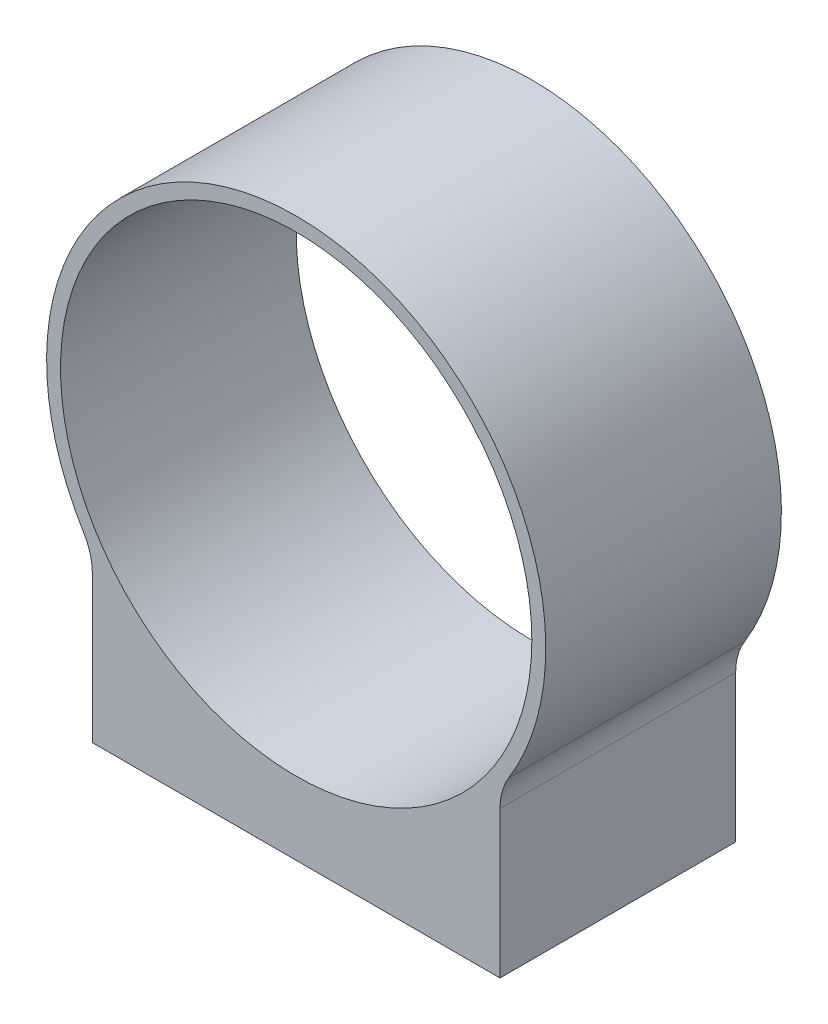
ISO-10303-21;
HEADER;
FILE_DESCRIPTION(('STEP AP214'),'2;1');
FILE_NAME('part.step','',(''),(''),'','','');
FILE_SCHEMA(('AUTOMOTIVE_DESIGN { 1 0 10303 214 1 1 1 1 }'));
ENDSEC;
DATA;
#1=APPLICATION_CONTEXT('core data for automotive mechanical design processes');
#2=APPLICATION_PROTOCOL_DEFINITION('international standard','automotive_design',2000,#1);
#3=PRODUCT_CONTEXT('',#1,'mechanical');
#4=PRODUCT('Part','Part','',(#3));
#5=PRODUCT_RELATED_PRODUCT_CATEGORY('part','',(#4));
#6=PRODUCT_DEFINITION_FORMATION('','',#4);
#7=PRODUCT_DEFINITION_CONTEXT('part definition',#1,'design');
#8=PRODUCT_DEFINITION('design','',#6,#7);
#9=PRODUCT_DEFINITION_SHAPE('','',#8);
#10=(LENGTH_UNIT() NAMED_UNIT(*) SI_UNIT(.MILLI.,.METRE.));
#11=(NAMED_UNIT(*) PLANE_ANGLE_UNIT() SI_UNIT($,.RADIAN.));
#12=(NAMED_UNIT(*) SI_UNIT($,.STERADIAN.) SOLID_ANGLE_UNIT());
#13=UNCERTAINTY_MEASURE_WITH_UNIT(LENGTH_MEASURE(1.E-05),#10,'distance_accuracy_value','');
#14=(GEOMETRIC_REPRESENTATION_CONTEXT(3) GLOBAL_UNCERTAINTY_ASSIGNED_CONTEXT((#13)) GLOBAL_UNIT_ASSIGNED_CONTEXT((#10,
#11,#12)) REPRESENTATION_CONTEXT('',''));
#15=CARTESIAN_POINT('',(0.,0.,0.));
#16=DIRECTION('',(0.,0.,1.));
#17=DIRECTION('',(1.,0.,0.));
#18=AXIS2_PLACEMENT_3D('',#15,#16,#17);
#19=CARTESIAN_POINT('',(0.,-52.3654098116473,40.));
#20=DIRECTION('',(0.,1.,0.));
#21=DIRECTION('',(-1.,0.,0.));
#22=AXIS2_PLACEMENT_3D('',#19,#20,#21);
#23=PLANE('',#22);
#24=CARTESIAN_POINT('',(-17.2996481832968,-52.3654098116473,20.));
#25=DIRECTION('',(0.,-1.,0.));
#26=DIRECTION('',(0.,0.,-1.));
#27=AXIS2_PLACEMENT_3D('',#24,#25,#26);
#28=CIRCLE('',#27,8.64394443249568);
#29=CARTESIAN_POINT('',(-17.2996481832968,-52.3654098116473,11.3560555675043));
#30=VERTEX_POINT('',#29);
#31=EDGE_CURVE('E302',#30,#30,#28,.T.);
#32=ORIENTED_EDGE('',*,*,#31,.F.);
#33=EDGE_LOOP('',(#32));
#34=FACE_BOUND('',#33,.T.);
#35=CARTESIAN_POINT('',(17.2996481832968,-52.3654098116473,20.));
#36=DIRECTION('',(0.,-1.,0.));
#37=DIRECTION('',(0.,0.,-1.));
#38=AXIS2_PLACEMENT_3D('',#35,#36,#37);
#39=CIRCLE('',#38,8.64394443249568);
#40=CARTESIAN_POINT('',(17.2996481832968,-52.3654098116473,11.3560555675043));
#41=VERTEX_POINT('',#40);
#42=EDGE_CURVE('E300',#41,#41,#39,.T.);
#43=ORIENTED_EDGE('',*,*,#42,.F.);
#44=EDGE_LOOP('',(#43));
#45=FACE_BOUND('',#44,.T.);
#46=DIRECTION('',(1.,0.,0.));
#47=VECTOR('',#46,1.);
#48=CARTESIAN_POINT('',(0.,-52.3654098116473,0.));
#49=LINE('',#48,#47);
#50=CARTESIAN_POINT('',(-34.5992963665935,-52.3654098116473,0.));
#51=VERTEX_POINT('',#50);
#52=CARTESIAN_POINT('',(34.5992963665935,-52.3654098116473,0.));
#53=VERTEX_POINT('',#52);
#54=EDGE_CURVE('E106',#51,#53,#49,.T.);
#55=ORIENTED_EDGE('',*,*,#54,.T.);
#56=DIRECTION('',(0.,0.,-1.));
#57=VECTOR('',#56,1.);
#58=CARTESIAN_POINT('',(34.5992963665935,-52.3654098116473,40.));
#59=LINE('',#58,#57);
#60=CARTESIAN_POINT('',(34.5992963665935,-52.3654098116473,40.));
#61=VERTEX_POINT('',#60);
#62=EDGE_CURVE('E88',#61,#53,#59,.T.);
#63=ORIENTED_EDGE('',*,*,#62,.F.);
#64=DIRECTION('',(1.,0.,0.));
#65=VECTOR('',#64,1.);
#66=CARTESIAN_POINT('',(0.,-52.3654098116473,40.));
#67=LINE('',#66,#65);
#68=CARTESIAN_POINT('',(-34.5992963665935,-52.3654098116473,40.));
#69=VERTEX_POINT('',#68);
#70=EDGE_CURVE('E93',#69,#61,#67,.T.);
#71=ORIENTED_EDGE('',*,*,#70,.F.);
#72=DIRECTION('',(0.,0.,-1.));
#73=VECTOR('',#72,1.);
#74=CARTESIAN_POINT('',(-34.5992963665935,-52.3654098116473,40.));
#75=LINE('',#74,#73);
#76=EDGE_CURVE('E108',#69,#51,#75,.T.);
#77=ORIENTED_EDGE('',*,*,#76,.T.);
#78=EDGE_LOOP('',(#55,#63,#71,#77));
#79=FACE_BOUND('',#78,.T.);
#80=ADVANCED_FACE('F35',(#34,#45,#79),#23,.F.);
#81=CARTESIAN_POINT('',(34.5992963665935,0.,40.));
#82=DIRECTION('',(1.,0.,0.));
#83=DIRECTION('',(0.,0.,-1.));
#84=AXIS2_PLACEMENT_3D('',#81,#82,#83);
#85=PLANE('',#84);
#86=DIRECTION('',(0.,-1.,0.));
#87=VECTOR('',#86,1.);
#88=CARTESIAN_POINT('',(34.5992963665935,0.,0.));
#89=LINE('',#88,#87);
#90=CARTESIAN_POINT('',(34.5992963665935,-27.4415943192775,0.));
#91=VERTEX_POINT('',#90);
#92=EDGE_CURVE('E144',#91,#53,#89,.T.);
#93=ORIENTED_EDGE('',*,*,#92,.F.);
#94=DIRECTION('',(0.,0.,-1.));
#95=VECTOR('',#94,1.);
#96=CARTESIAN_POINT('',(34.5992963665935,-27.4415943192775,40.));
#97=LINE('',#96,#95);
#98=CARTESIAN_POINT('',(34.5992963665935,-27.4415943192775,40.));
#99=VERTEX_POINT('',#98);
#100=EDGE_CURVE('E50',#91,#99,#97,.F.);
#101=ORIENTED_EDGE('',*,*,#100,.T.);
#102=DIRECTION('',(0.,-1.,0.));
#103=VECTOR('',#102,1.);
#104=CARTESIAN_POINT('',(34.5992963665935,0.,40.));
#105=LINE('',#104,#103);
#106=EDGE_CURVE('E84',#99,#61,#105,.T.);
#107=ORIENTED_EDGE('',*,*,#106,.T.);
#108=ORIENTED_EDGE('',*,*,#62,.T.);
#109=EDGE_LOOP('',(#93,#101,#107,#108));
#110=FACE_BOUND('',#109,.T.);
#111=ADVANCED_FACE('F86',(#110),#85,.T.);
#112=CARTESIAN_POINT('',(0.,0.,40.));
#113=DIRECTION('',(0.,0.,-1.));
#114=DIRECTION('',(-1.,0.,0.));
#115=AXIS2_PLACEMENT_3D('',#112,#113,#114);
#116=CYLINDRICAL_SURFACE('',#115,42.3654307265685);
#117=CARTESIAN_POINT('',(0.,0.,0.));
#118=DIRECTION('',(0.,0.,1.));
#119=DIRECTION('',(1.,0.,0.));
#120=AXIS2_PLACEMENT_3D('',#117,#118,#119);
#121=CIRCLE('',#120,42.3654307265685);
#122=CARTESIAN_POINT('',(36.0823614826864,-22.2011916455047,0.));
#123=VERTEX_POINT('',#122);
#124=CARTESIAN_POINT('',(-36.0823614826864,-22.2011916455047,0.));
#125=VERTEX_POINT('',#124);
#126=EDGE_CURVE('E139',#123,#125,#121,.T.);
#127=ORIENTED_EDGE('',*,*,#126,.T.);
#128=DIRECTION('',(0.,0.,-1.));
#129=VECTOR('',#128,1.);
#130=CARTESIAN_POINT('',(-36.0823614826864,-22.2011916455047,40.));
#131=LINE('',#130,#129);
#132=CARTESIAN_POINT('',(-36.0823614826864,-22.2011916455047,40.));
#133=VERTEX_POINT('',#132);
#134=EDGE_CURVE('E119',#125,#133,#131,.F.);
#135=ORIENTED_EDGE('',*,*,#134,.T.);
#136=CARTESIAN_POINT('',(0.,0.,40.));
#137=DIRECTION('',(0.,0.,1.));
#138=DIRECTION('',(1.,0.,0.));
#139=AXIS2_PLACEMENT_3D('',#136,#137,#138);
#140=CIRCLE('',#139,42.3654307265685);
#141=CARTESIAN_POINT('',(36.0823614826864,-22.2011916455047,40.));
#142=VERTEX_POINT('',#141);
#143=EDGE_CURVE('E92',#142,#133,#140,.T.);
#144=ORIENTED_EDGE('',*,*,#143,.F.);
#145=DIRECTION('',(0.,0.,-1.));
#146=VECTOR('',#145,1.);
#147=CARTESIAN_POINT('',(36.0823614826864,-22.2011916455047,40.));
#148=LINE('',#147,#146);
#149=EDGE_CURVE('E111',#142,#123,#148,.T.);
#150=ORIENTED_EDGE('',*,*,#149,.T.);
#151=EDGE_LOOP('',(#127,#135,#144,#150));
#152=FACE_BOUND('',#151,.T.);
#153=ADVANCED_FACE('F142',(#152),#116,.T.);
#154=CARTESIAN_POINT('',(-34.5992963665935,0.,40.));
#155=DIRECTION('',(1.,0.,0.));
#156=DIRECTION('',(0.,0.,-1.));
#157=AXIS2_PLACEMENT_3D('',#154,#155,#156);
#158=PLANE('',#157);
#159=DIRECTION('',(0.,-1.,0.));
#160=VECTOR('',#159,1.);
#161=CARTESIAN_POINT('',(-34.5992963665935,0.,40.));
#162=LINE('',#161,#160);
#163=CARTESIAN_POINT('',(-34.5992963665935,-27.4415943192775,40.));
#164=VERTEX_POINT('',#163);
#165=EDGE_CURVE('E99',#164,#69,#162,.T.);
#166=ORIENTED_EDGE('',*,*,#165,.F.);
#167=DIRECTION('',(0.,0.,1.));
#168=VECTOR('',#167,1.);
#169=CARTESIAN_POINT('',(-34.5992963665935,-27.4415943192775,0.));
#170=LINE('',#169,#168);
#171=CARTESIAN_POINT('',(-34.5992963665935,-27.4415943192775,0.));
#172=VERTEX_POINT('',#171);
#173=EDGE_CURVE('E107',#164,#172,#170,.F.);
#174=ORIENTED_EDGE('',*,*,#173,.T.);
#175=DIRECTION('',(0.,-1.,0.));
#176=VECTOR('',#175,1.);
#177=CARTESIAN_POINT('',(-34.5992963665935,0.,0.));
#178=LINE('',#177,#176);
#179=EDGE_CURVE('E140',#172,#51,#178,.T.);
#180=ORIENTED_EDGE('',*,*,#179,.T.);
#181=ORIENTED_EDGE('',*,*,#76,.F.);
#182=EDGE_LOOP('',(#166,#174,#180,#181));
#183=FACE_BOUND('',#182,.T.);
#184=ADVANCED_FACE('F132',(#183),#158,.F.);
#185=CARTESIAN_POINT('',(0.,0.,40.));
#186=DIRECTION('',(0.,0.,-1.));
#187=DIRECTION('',(-1.,0.,0.));
#188=AXIS2_PLACEMENT_3D('',#185,#186,#187);
#189=CYLINDRICAL_SURFACE('',#188,40.);
#190=CARTESIAN_POINT('',(0.,0.,40.));
#191=DIRECTION('',(0.,0.,1.));
#192=DIRECTION('',(1.,0.,0.));
#193=AXIS2_PLACEMENT_3D('',#190,#191,#192);
#194=CIRCLE('',#193,40.);
#195=CARTESIAN_POINT('',(40.,0.,40.));
#196=VERTEX_POINT('',#195);
#197=EDGE_CURVE('E113',#196,#196,#194,.T.);
#198=ORIENTED_EDGE('',*,*,#197,.T.);
#199=EDGE_LOOP('',(#198));
#200=FACE_BOUND('',#199,.T.);
#201=CARTESIAN_POINT('',(0.,0.,0.));
#202=DIRECTION('',(0.,0.,1.));
#203=DIRECTION('',(1.,0.,0.));
#204=AXIS2_PLACEMENT_3D('',#201,#202,#203);
#205=CIRCLE('',#204,40.);
#206=CARTESIAN_POINT('',(40.,0.,0.));
#207=VERTEX_POINT('',#206);
#208=EDGE_CURVE('E103',#207,#207,#205,.T.);
#209=ORIENTED_EDGE('',*,*,#208,.F.);
#210=EDGE_LOOP('',(#209));
#211=FACE_BOUND('',#210,.T.);
#212=ADVANCED_FACE('F152',(#200,#211),#189,.F.);
#213=CARTESIAN_POINT('',(0.,0.,40.));
#214=DIRECTION('',(0.,0.,1.));
#215=DIRECTION('',(1.,0.,0.));
#216=AXIS2_PLACEMENT_3D('',#213,#214,#215);
#217=PLANE('',#216);
#218=ORIENTED_EDGE('',*,*,#70,.T.);
#219=ORIENTED_EDGE('',*,*,#106,.F.);
#220=CARTESIAN_POINT('',(44.5992963665935,-27.4415943192775,40.));
#221=DIRECTION('',(0.,0.,1.));
#222=DIRECTION('',(1.,0.,0.));
#223=AXIS2_PLACEMENT_3D('',#220,#221,#222);
#224=CIRCLE('',#223,10.);
#225=EDGE_CURVE('E11',#99,#142,#224,.F.);
#226=ORIENTED_EDGE('',*,*,#225,.T.);
#227=ORIENTED_EDGE('',*,*,#143,.T.);
#228=CARTESIAN_POINT('',(-44.5992963665935,-27.4415943192775,40.));
#229=DIRECTION('',(0.,0.,1.));
#230=DIRECTION('',(1.,0.,0.));
#231=AXIS2_PLACEMENT_3D('',#228,#229,#230);
#232=CIRCLE('',#231,10.);
#233=EDGE_CURVE('E124',#133,#164,#232,.F.);
#234=ORIENTED_EDGE('',*,*,#233,.T.);
#235=ORIENTED_EDGE('',*,*,#165,.T.);
#236=EDGE_LOOP('',(#218,#219,#226,#227,#234,#235));
#237=FACE_BOUND('',#236,.T.);
#238=ORIENTED_EDGE('',*,*,#197,.F.);
#239=EDGE_LOOP('',(#238));
#240=FACE_BOUND('',#239,.T.);
#241=ADVANCED_FACE('F96',(#237,#240),#217,.T.);
#242=CARTESIAN_POINT('',(0.,0.,0.));
#243=DIRECTION('',(0.,0.,1.));
#244=DIRECTION('',(1.,0.,0.));
#245=AXIS2_PLACEMENT_3D('',#242,#243,#244);
#246=PLANE('',#245);
#247=ORIENTED_EDGE('',*,*,#54,.F.);
#248=ORIENTED_EDGE('',*,*,#179,.F.);
#249=CARTESIAN_POINT('',(-44.5992963665935,-27.4415943192775,0.));
#250=DIRECTION('',(0.,0.,1.));
#251=DIRECTION('',(1.,0.,0.));
#252=AXIS2_PLACEMENT_3D('',#249,#250,#251);
#253=CIRCLE('',#252,10.);
#254=EDGE_CURVE('E122',#172,#125,#253,.T.);
#255=ORIENTED_EDGE('',*,*,#254,.T.);
#256=ORIENTED_EDGE('',*,*,#126,.F.);
#257=CARTESIAN_POINT('',(44.5992963665935,-27.4415943192775,0.));
#258=DIRECTION('',(0.,0.,1.));
#259=DIRECTION('',(1.,0.,0.));
#260=AXIS2_PLACEMENT_3D('',#257,#258,#259);
#261=CIRCLE('',#260,10.);
#262=EDGE_CURVE('E43',#123,#91,#261,.T.);
#263=ORIENTED_EDGE('',*,*,#262,.T.);
#264=ORIENTED_EDGE('',*,*,#92,.T.);
#265=EDGE_LOOP('',(#247,#248,#255,#256,#263,#264));
#266=FACE_BOUND('',#265,.T.);
#267=ORIENTED_EDGE('',*,*,#208,.T.);
#268=EDGE_LOOP('',(#267));
#269=FACE_BOUND('',#268,.T.);
#270=ADVANCED_FACE('F137',(#266,#269),#246,.F.);
#271=CARTESIAN_POINT('',(17.2996481832968,-42.3654098116473,20.));
#272=DIRECTION('',(0.,-1.,0.));
#273=DIRECTION('',(0.,0.,-1.));
#274=AXIS2_PLACEMENT_3D('',#271,#272,#273);
#275=CYLINDRICAL_SURFACE('',#274,8.64394443249568);
#276=CARTESIAN_POINT('',(17.2996481832968,-42.3654098116473,20.));
#277=DIRECTION('',(0.,-1.,0.));
#278=DIRECTION('',(0.,0.,-1.));
#279=AXIS2_PLACEMENT_3D('',#276,#277,#278);
#280=CIRCLE('',#279,8.64394443249568);
#281=CARTESIAN_POINT('',(17.2996481832968,-42.3654098116473,11.3560555675043));
#282=VERTEX_POINT('',#281);
#283=EDGE_CURVE('E297',#282,#282,#280,.T.);
#284=ORIENTED_EDGE('',*,*,#283,.F.);
#285=EDGE_LOOP('',(#284));
#286=FACE_BOUND('',#285,.T.);
#287=ORIENTED_EDGE('',*,*,#42,.T.);
#288=EDGE_LOOP('',(#287));
#289=FACE_BOUND('',#288,.T.);
#290=ADVANCED_FACE('F194',(#286,#289),#275,.F.);
#291=CARTESIAN_POINT('',(0.,-42.3654098116473,0.));
#292=DIRECTION('',(0.,-1.,0.));
#293=DIRECTION('',(0.,0.,-1.));
#294=AXIS2_PLACEMENT_3D('',#291,#292,#293);
#295=PLANE('',#294);
#296=ORIENTED_EDGE('',*,*,#283,.T.);
#297=EDGE_LOOP('',(#296));
#298=FACE_BOUND('',#297,.T.);
#299=ADVANCED_FACE('F187',(#298),#295,.T.);
#300=CARTESIAN_POINT('',(-17.2996481832968,-42.3654098116473,20.));
#301=DIRECTION('',(0.,-1.,0.));
#302=DIRECTION('',(0.,0.,-1.));
#303=AXIS2_PLACEMENT_3D('',#300,#301,#302);
#304=CYLINDRICAL_SURFACE('',#303,8.64394443249568);
#305=CARTESIAN_POINT('',(-17.2996481832968,-42.3654098116473,20.));
#306=DIRECTION('',(0.,-1.,0.));
#307=DIRECTION('',(0.,0.,-1.));
#308=AXIS2_PLACEMENT_3D('',#305,#306,#307);
#309=CIRCLE('',#308,8.64394443249568);
#310=CARTESIAN_POINT('',(-17.2996481832968,-42.3654098116473,11.3560555675043));
#311=VERTEX_POINT('',#310);
#312=EDGE_CURVE('E307',#311,#311,#309,.T.);
#313=ORIENTED_EDGE('',*,*,#312,.F.);
#314=EDGE_LOOP('',(#313));
#315=FACE_BOUND('',#314,.T.);
#316=ORIENTED_EDGE('',*,*,#31,.T.);
#317=EDGE_LOOP('',(#316));
#318=FACE_BOUND('',#317,.T.);
#319=ADVANCED_FACE('F181',(#315,#318),#304,.F.);
#320=CARTESIAN_POINT('',(0.,-42.3654098116473,0.));
#321=DIRECTION('',(0.,-1.,0.));
#322=DIRECTION('',(0.,0.,-1.));
#323=AXIS2_PLACEMENT_3D('',#320,#321,#322);
#324=PLANE('',#323);
#325=ORIENTED_EDGE('',*,*,#312,.T.);
#326=EDGE_LOOP('',(#325));
#327=FACE_BOUND('',#326,.T.);
#328=ADVANCED_FACE('F175',(#327),#324,.T.);
#329=CARTESIAN_POINT('',(-44.5992963665935,-27.4415943192775,40.));
#330=DIRECTION('',(0.,0.,-1.));
#331=DIRECTION('',(-1.,0.,0.));
#332=AXIS2_PLACEMENT_3D('',#329,#330,#331);
#333=CYLINDRICAL_SURFACE('',#332,10.);
#334=ORIENTED_EDGE('',*,*,#233,.F.);
#335=ORIENTED_EDGE('',*,*,#134,.F.);
#336=ORIENTED_EDGE('',*,*,#254,.F.);
#337=ORIENTED_EDGE('',*,*,#173,.F.);
#338=EDGE_LOOP('',(#334,#335,#336,#337));
#339=FACE_BOUND('',#338,.T.);
#340=ADVANCED_FACE('F135',(#339),#333,.F.);
#341=CARTESIAN_POINT('',(44.5992963665935,-27.4415943192775,40.));
#342=DIRECTION('',(0.,0.,-1.));
#343=DIRECTION('',(-1.,0.,0.));
#344=AXIS2_PLACEMENT_3D('',#341,#342,#343);
#345=CYLINDRICAL_SURFACE('',#344,10.);
#346=ORIENTED_EDGE('',*,*,#225,.F.);
#347=ORIENTED_EDGE('',*,*,#100,.F.);
#348=ORIENTED_EDGE('',*,*,#262,.F.);
#349=ORIENTED_EDGE('',*,*,#149,.F.);
#350=EDGE_LOOP('',(#346,#347,#348,#349));
#351=FACE_BOUND('',#350,.T.);
#352=ADVANCED_FACE('F37',(#351),#345,.F.);
#353=CLOSED_SHELL('',(#80,#111,#153,#184,#212,#241,#270,#290,#299,#319,#328,#340,#352));
#354=MANIFOLD_SOLID_BREP('B2',#353);
#355=ADVANCED_BREP_SHAPE_REPRESENTATION('',(#18,#354),#14);
#356=SHAPE_DEFINITION_REPRESENTATION(#9,#355);
ENDSEC;
END-ISO-10303-21;
